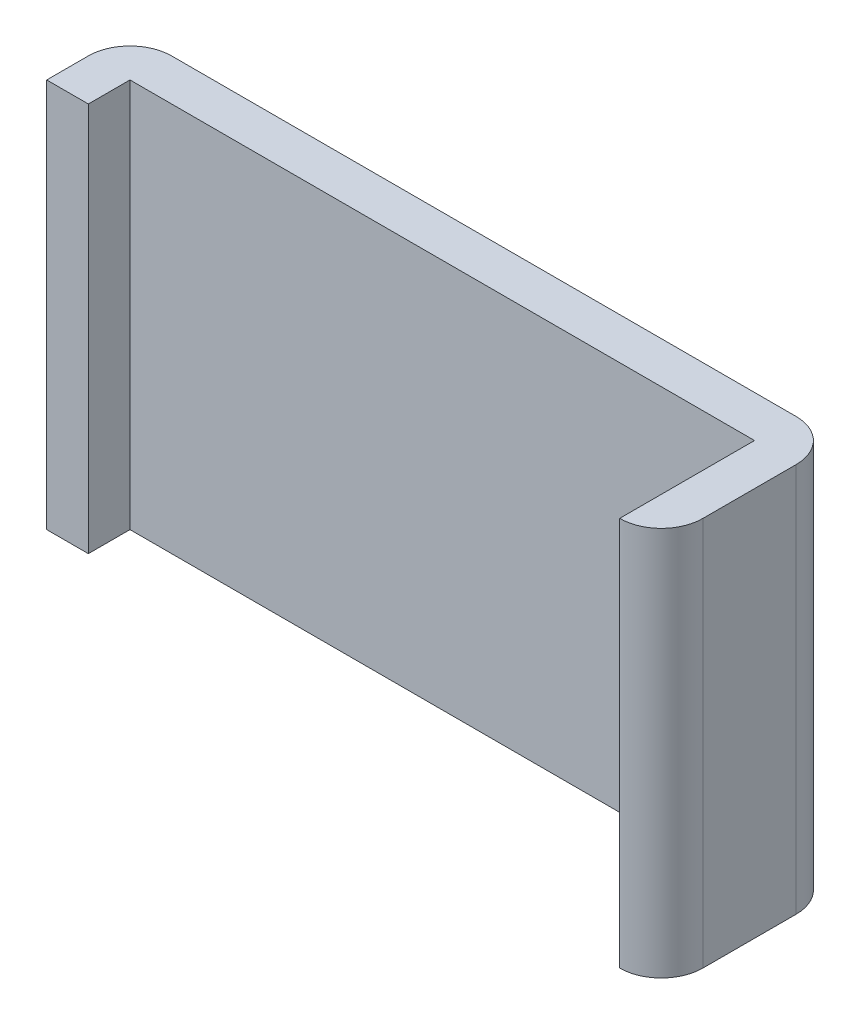
ISO-10303-21;
HEADER;
FILE_DESCRIPTION(('STEP AP214'),'2;1');
FILE_NAME('part.step','',(''),(''),'','','');
FILE_SCHEMA(('AUTOMOTIVE_DESIGN { 1 0 10303 214 1 1 1 1 }'));
ENDSEC;
DATA;
#1=APPLICATION_CONTEXT('core data for automotive mechanical design processes');
#2=APPLICATION_PROTOCOL_DEFINITION('international standard','automotive_design',2000,#1);
#3=PRODUCT_CONTEXT('',#1,'mechanical');
#4=PRODUCT('Part','Part','',(#3));
#5=PRODUCT_RELATED_PRODUCT_CATEGORY('part','',(#4));
#6=PRODUCT_DEFINITION_FORMATION('','',#4);
#7=PRODUCT_DEFINITION_CONTEXT('part definition',#1,'design');
#8=PRODUCT_DEFINITION('design','',#6,#7);
#9=PRODUCT_DEFINITION_SHAPE('','',#8);
#10=(LENGTH_UNIT() NAMED_UNIT(*) SI_UNIT(.MILLI.,.METRE.));
#11=(NAMED_UNIT(*) PLANE_ANGLE_UNIT() SI_UNIT($,.RADIAN.));
#12=(NAMED_UNIT(*) SI_UNIT($,.STERADIAN.) SOLID_ANGLE_UNIT());
#13=UNCERTAINTY_MEASURE_WITH_UNIT(LENGTH_MEASURE(1.E-05),#10,'distance_accuracy_value','');
#14=(GEOMETRIC_REPRESENTATION_CONTEXT(3) GLOBAL_UNCERTAINTY_ASSIGNED_CONTEXT((#13)) GLOBAL_UNIT_ASSIGNED_CONTEXT((#10,
#11,#12)) REPRESENTATION_CONTEXT('',''));
#15=CARTESIAN_POINT('',(0.,0.,0.));
#16=DIRECTION('',(0.,0.,1.));
#17=DIRECTION('',(1.,0.,0.));
#18=AXIS2_PLACEMENT_3D('',#15,#16,#17);
#19=CARTESIAN_POINT('',(4.575,-1.8042,0.81));
#20=DIRECTION('',(0.,-1.,0.));
#21=DIRECTION('',(0.,0.,-1.));
#22=AXIS2_PLACEMENT_3D('',#19,#20,#21);
#23=CYLINDRICAL_SURFACE('',#22,0.25);
#24=CARTESIAN_POINT('',(4.575,0.5342,0.81));
#25=DIRECTION('',(0.,-1.,0.));
#26=DIRECTION('',(0.,0.,-1.));
#27=AXIS2_PLACEMENT_3D('',#24,#25,#26);
#28=CIRCLE('',#27,0.25);
#29=CARTESIAN_POINT('',(4.825,0.5342,0.81));
#30=VERTEX_POINT('',#29);
#31=CARTESIAN_POINT('',(4.575,0.5342,1.06));
#32=VERTEX_POINT('',#31);
#33=EDGE_CURVE('E85',#30,#32,#28,.T.);
#34=ORIENTED_EDGE('',*,*,#33,.T.);
#35=DIRECTION('',(0.,-1.,0.));
#36=VECTOR('',#35,1.);
#37=CARTESIAN_POINT('',(4.575,-1.8042,1.06));
#38=LINE('',#37,#36);
#39=CARTESIAN_POINT('',(4.575,-1.8042,1.06));
#40=VERTEX_POINT('',#39);
#41=EDGE_CURVE('E71',#32,#40,#38,.T.);
#42=ORIENTED_EDGE('',*,*,#41,.T.);
#43=CARTESIAN_POINT('',(4.575,-1.8042,0.81));
#44=DIRECTION('',(0.,-1.,0.));
#45=DIRECTION('',(0.,0.,-1.));
#46=AXIS2_PLACEMENT_3D('',#43,#44,#45);
#47=CIRCLE('',#46,0.25);
#48=CARTESIAN_POINT('',(4.825,-1.8042,0.81));
#49=VERTEX_POINT('',#48);
#50=EDGE_CURVE('E20',#40,#49,#47,.F.);
#51=ORIENTED_EDGE('',*,*,#50,.T.);
#52=DIRECTION('',(0.,1.,0.));
#53=VECTOR('',#52,1.);
#54=CARTESIAN_POINT('',(4.825,-1.8042,0.81));
#55=LINE('',#54,#53);
#56=EDGE_CURVE('E77',#49,#30,#55,.T.);
#57=ORIENTED_EDGE('',*,*,#56,.T.);
#58=EDGE_LOOP('',(#34,#42,#51,#57));
#59=FACE_BOUND('',#58,.T.);
#60=ADVANCED_FACE('F17',(#59),#23,.T.);
#61=CARTESIAN_POINT('',(0.575,-1.8042,0.5));
#62=DIRECTION('',(0.,0.,-1.));
#63=DIRECTION('',(-1.,0.,0.));
#64=AXIS2_PLACEMENT_3D('',#61,#62,#63);
#65=PLANE('',#64);
#66=DIRECTION('',(0.,1.,0.));
#67=VECTOR('',#66,1.);
#68=CARTESIAN_POINT('',(0.825,-1.8042,0.5));
#69=LINE('',#68,#67);
#70=CARTESIAN_POINT('',(0.825,-1.8042,0.5));
#71=VERTEX_POINT('',#70);
#72=CARTESIAN_POINT('',(0.825,0.5342,0.5));
#73=VERTEX_POINT('',#72);
#74=EDGE_CURVE('E117',#71,#73,#69,.T.);
#75=ORIENTED_EDGE('',*,*,#74,.T.);
#76=DIRECTION('',(-1.,0.,0.));
#77=VECTOR('',#76,1.);
#78=CARTESIAN_POINT('',(0.575,0.5342,0.5));
#79=LINE('',#78,#77);
#80=CARTESIAN_POINT('',(0.575,0.5342,0.5));
#81=VERTEX_POINT('',#80);
#82=EDGE_CURVE('E86',#81,#73,#79,.F.);
#83=ORIENTED_EDGE('',*,*,#82,.F.);
#84=DIRECTION('',(0.,1.,0.));
#85=VECTOR('',#84,1.);
#86=CARTESIAN_POINT('',(0.575,-1.8042,0.5));
#87=LINE('',#86,#85);
#88=CARTESIAN_POINT('',(0.575,-1.8042,0.5));
#89=VERTEX_POINT('',#88);
#90=EDGE_CURVE('E138',#81,#89,#87,.F.);
#91=ORIENTED_EDGE('',*,*,#90,.T.);
#92=DIRECTION('',(-1.,0.,0.));
#93=VECTOR('',#92,1.);
#94=CARTESIAN_POINT('',(0.575,-1.8042,0.5));
#95=LINE('',#94,#93);
#96=EDGE_CURVE('E126',#71,#89,#95,.T.);
#97=ORIENTED_EDGE('',*,*,#96,.F.);
#98=EDGE_LOOP('',(#75,#83,#91,#97));
#99=FACE_BOUND('',#98,.T.);
#100=ADVANCED_FACE('F300',(#99),#65,.F.);
#101=CARTESIAN_POINT('',(0.825,-1.8042,0.5));
#102=DIRECTION('',(-1.,0.,0.));
#103=DIRECTION('',(0.,0.,1.));
#104=AXIS2_PLACEMENT_3D('',#101,#102,#103);
#105=PLANE('',#104);
#106=DIRECTION('',(0.,1.,0.));
#107=VECTOR('',#106,1.);
#108=CARTESIAN_POINT('',(0.825,-1.8042,0.25));
#109=LINE('',#108,#107);
#110=CARTESIAN_POINT('',(0.825,-1.8042,0.25));
#111=VERTEX_POINT('',#110);
#112=CARTESIAN_POINT('',(0.825,0.5342,0.25));
#113=VERTEX_POINT('',#112);
#114=EDGE_CURVE('E148',#111,#113,#109,.T.);
#115=ORIENTED_EDGE('',*,*,#114,.T.);
#116=DIRECTION('',(0.,0.,1.));
#117=VECTOR('',#116,1.);
#118=CARTESIAN_POINT('',(0.825,0.5342,0.5));
#119=LINE('',#118,#117);
#120=EDGE_CURVE('E114',#73,#113,#119,.F.);
#121=ORIENTED_EDGE('',*,*,#120,.F.);
#122=ORIENTED_EDGE('',*,*,#74,.F.);
#123=DIRECTION('',(0.,0.,1.));
#124=VECTOR('',#123,1.);
#125=CARTESIAN_POINT('',(0.825,-1.8042,0.5));
#126=LINE('',#125,#124);
#127=EDGE_CURVE('E109',#111,#71,#126,.T.);
#128=ORIENTED_EDGE('',*,*,#127,.F.);
#129=EDGE_LOOP('',(#115,#121,#122,#128));
#130=FACE_BOUND('',#129,.T.);
#131=ADVANCED_FACE('F222',(#130),#105,.F.);
#132=CARTESIAN_POINT('',(4.575,-1.8042,0.25));
#133=DIRECTION('',(1.,0.,0.));
#134=DIRECTION('',(0.,0.,-1.));
#135=AXIS2_PLACEMENT_3D('',#132,#133,#134);
#136=PLANE('',#135);
#137=DIRECTION('',(0.,0.,-1.));
#138=VECTOR('',#137,1.);
#139=CARTESIAN_POINT('',(4.575,-1.8042,0.25));
#140=LINE('',#139,#138);
#141=CARTESIAN_POINT('',(4.575,-1.8042,0.25));
#142=VERTEX_POINT('',#141);
#143=EDGE_CURVE('E67',#40,#142,#140,.T.);
#144=ORIENTED_EDGE('',*,*,#143,.F.);
#145=ORIENTED_EDGE('',*,*,#41,.F.);
#146=DIRECTION('',(0.,0.,-1.));
#147=VECTOR('',#146,1.);
#148=CARTESIAN_POINT('',(4.575,0.5342,0.25));
#149=LINE('',#148,#147);
#150=CARTESIAN_POINT('',(4.575,0.5342,0.25));
#151=VERTEX_POINT('',#150);
#152=EDGE_CURVE('E78',#151,#32,#149,.F.);
#153=ORIENTED_EDGE('',*,*,#152,.F.);
#154=DIRECTION('',(0.,1.,0.));
#155=VECTOR('',#154,1.);
#156=CARTESIAN_POINT('',(4.575,-1.8042,0.25));
#157=LINE('',#156,#155);
#158=EDGE_CURVE('E73',#151,#142,#157,.F.);
#159=ORIENTED_EDGE('',*,*,#158,.T.);
#160=EDGE_LOOP('',(#144,#145,#153,#159));
#161=FACE_BOUND('',#160,.T.);
#162=ADVANCED_FACE('F69',(#161),#136,.F.);
#163=CARTESIAN_POINT('',(4.825,-1.8042,0.81));
#164=DIRECTION('',(-1.,0.,0.));
#165=DIRECTION('',(0.,0.,1.));
#166=AXIS2_PLACEMENT_3D('',#163,#164,#165);
#167=PLANE('',#166);
#168=DIRECTION('',(0.,-1.,0.));
#169=VECTOR('',#168,1.);
#170=CARTESIAN_POINT('',(4.825,-1.8042,0.25));
#171=LINE('',#170,#169);
#172=CARTESIAN_POINT('',(4.825,0.5342,0.25));
#173=VERTEX_POINT('',#172);
#174=CARTESIAN_POINT('',(4.825,-1.8042,0.25));
#175=VERTEX_POINT('',#174);
#176=EDGE_CURVE('E152',#173,#175,#171,.T.);
#177=ORIENTED_EDGE('',*,*,#176,.F.);
#178=DIRECTION('',(0.,0.,1.));
#179=VECTOR('',#178,1.);
#180=CARTESIAN_POINT('',(4.825,0.5342,0.81));
#181=LINE('',#180,#179);
#182=EDGE_CURVE('E128',#30,#173,#181,.F.);
#183=ORIENTED_EDGE('',*,*,#182,.F.);
#184=ORIENTED_EDGE('',*,*,#56,.F.);
#185=DIRECTION('',(0.,0.,1.));
#186=VECTOR('',#185,1.);
#187=CARTESIAN_POINT('',(4.825,-1.8042,0.81));
#188=LINE('',#187,#186);
#189=EDGE_CURVE('E92',#175,#49,#188,.T.);
#190=ORIENTED_EDGE('',*,*,#189,.F.);
#191=EDGE_LOOP('',(#177,#183,#184,#190));
#192=FACE_BOUND('',#191,.T.);
#193=ADVANCED_FACE('F213',(#192),#167,.F.);
#194=CARTESIAN_POINT('',(0.575,-1.8042,0.25));
#195=DIRECTION('',(1.,0.,0.));
#196=DIRECTION('',(0.,0.,-1.));
#197=AXIS2_PLACEMENT_3D('',#194,#195,#196);
#198=PLANE('',#197);
#199=ORIENTED_EDGE('',*,*,#90,.F.);
#200=DIRECTION('',(0.,0.,-1.));
#201=VECTOR('',#200,1.);
#202=CARTESIAN_POINT('',(0.575,0.5342,0.25));
#203=LINE('',#202,#201);
#204=CARTESIAN_POINT('',(0.575,0.5342,0.25));
#205=VERTEX_POINT('',#204);
#206=EDGE_CURVE('E98',#81,#205,#203,.T.);
#207=ORIENTED_EDGE('',*,*,#206,.T.);
#208=DIRECTION('',(0.,-1.,0.));
#209=VECTOR('',#208,1.);
#210=CARTESIAN_POINT('',(0.575,-1.8042,0.25));
#211=LINE('',#210,#209);
#212=CARTESIAN_POINT('',(0.575,-1.8042,0.25));
#213=VERTEX_POINT('',#212);
#214=EDGE_CURVE('E97',#213,#205,#211,.F.);
#215=ORIENTED_EDGE('',*,*,#214,.F.);
#216=DIRECTION('',(0.,0.,-1.));
#217=VECTOR('',#216,1.);
#218=CARTESIAN_POINT('',(0.575,-1.8042,0.25));
#219=LINE('',#218,#217);
#220=EDGE_CURVE('E144',#89,#213,#219,.T.);
#221=ORIENTED_EDGE('',*,*,#220,.F.);
#222=EDGE_LOOP('',(#199,#207,#215,#221));
#223=FACE_BOUND('',#222,.T.);
#224=ADVANCED_FACE('F198',(#223),#198,.F.);
#225=CARTESIAN_POINT('',(0.825,-1.8042,0.25));
#226=DIRECTION('',(0.,0.,-1.));
#227=DIRECTION('',(-1.,0.,0.));
#228=AXIS2_PLACEMENT_3D('',#225,#226,#227);
#229=PLANE('',#228);
#230=ORIENTED_EDGE('',*,*,#158,.F.);
#231=DIRECTION('',(1.,0.,0.));
#232=VECTOR('',#231,1.);
#233=CARTESIAN_POINT('',(4.575,0.5342,0.25));
#234=LINE('',#233,#232);
#235=EDGE_CURVE('E156',#151,#113,#234,.F.);
#236=ORIENTED_EDGE('',*,*,#235,.T.);
#237=ORIENTED_EDGE('',*,*,#114,.F.);
#238=DIRECTION('',(1.,0.,0.));
#239=VECTOR('',#238,1.);
#240=CARTESIAN_POINT('',(4.575,-1.8042,0.25));
#241=LINE('',#240,#239);
#242=EDGE_CURVE('E101',#142,#111,#241,.F.);
#243=ORIENTED_EDGE('',*,*,#242,.F.);
#244=EDGE_LOOP('',(#230,#236,#237,#243));
#245=FACE_BOUND('',#244,.T.);
#246=ADVANCED_FACE('F175',(#245),#229,.F.);
#247=CARTESIAN_POINT('',(4.575,-1.8042,0.25));
#248=DIRECTION('',(0.,-1.,0.));
#249=DIRECTION('',(0.,0.,-1.));
#250=AXIS2_PLACEMENT_3D('',#247,#248,#249);
#251=CYLINDRICAL_SURFACE('',#250,0.25);
#252=CARTESIAN_POINT('',(4.575,0.5342,0.25));
#253=DIRECTION('',(0.,-1.,0.));
#254=DIRECTION('',(0.,0.,-1.));
#255=AXIS2_PLACEMENT_3D('',#252,#253,#254);
#256=CIRCLE('',#255,0.25);
#257=CARTESIAN_POINT('',(4.575,0.5342,0.));
#258=VERTEX_POINT('',#257);
#259=EDGE_CURVE('E94',#258,#173,#256,.T.);
#260=ORIENTED_EDGE('',*,*,#259,.T.);
#261=ORIENTED_EDGE('',*,*,#176,.T.);
#262=CARTESIAN_POINT('',(4.575,-1.8042,0.25));
#263=DIRECTION('',(0.,-1.,0.));
#264=DIRECTION('',(0.,0.,-1.));
#265=AXIS2_PLACEMENT_3D('',#262,#263,#264);
#266=CIRCLE('',#265,0.25);
#267=CARTESIAN_POINT('',(4.575,-1.8042,0.));
#268=VERTEX_POINT('',#267);
#269=EDGE_CURVE('E103',#268,#175,#266,.T.);
#270=ORIENTED_EDGE('',*,*,#269,.F.);
#271=DIRECTION('',(0.,1.,0.));
#272=VECTOR('',#271,1.);
#273=CARTESIAN_POINT('',(4.575,-1.8042,0.));
#274=LINE('',#273,#272);
#275=EDGE_CURVE('E105',#268,#258,#274,.T.);
#276=ORIENTED_EDGE('',*,*,#275,.T.);
#277=EDGE_LOOP('',(#260,#261,#270,#276));
#278=FACE_BOUND('',#277,.T.);
#279=ADVANCED_FACE('F211',(#278),#251,.T.);
#280=CARTESIAN_POINT('',(4.575,0.5342,0.25));
#281=DIRECTION('',(0.,-1.,0.));
#282=DIRECTION('',(0.,0.,-1.));
#283=AXIS2_PLACEMENT_3D('',#280,#281,#282);
#284=PLANE('',#283);
#285=ORIENTED_EDGE('',*,*,#152,.T.);
#286=ORIENTED_EDGE('',*,*,#33,.F.);
#287=ORIENTED_EDGE('',*,*,#182,.T.);
#288=ORIENTED_EDGE('',*,*,#259,.F.);
#289=DIRECTION('',(1.,0.,0.));
#290=VECTOR('',#289,1.);
#291=CARTESIAN_POINT('',(4.575,0.5342,0.));
#292=LINE('',#291,#290);
#293=CARTESIAN_POINT('',(0.825,0.5342,0.));
#294=VERTEX_POINT('',#293);
#295=EDGE_CURVE('E163',#258,#294,#292,.F.);
#296=ORIENTED_EDGE('',*,*,#295,.T.);
#297=CARTESIAN_POINT('',(0.825,0.5342,0.25));
#298=DIRECTION('',(0.,-1.,0.));
#299=DIRECTION('',(0.,0.,-1.));
#300=AXIS2_PLACEMENT_3D('',#297,#298,#299);
#301=CIRCLE('',#300,0.25);
#302=EDGE_CURVE('E99',#205,#294,#301,.T.);
#303=ORIENTED_EDGE('',*,*,#302,.F.);
#304=ORIENTED_EDGE('',*,*,#206,.F.);
#305=ORIENTED_EDGE('',*,*,#82,.T.);
#306=ORIENTED_EDGE('',*,*,#120,.T.);
#307=ORIENTED_EDGE('',*,*,#235,.F.);
#308=EDGE_LOOP('',(#285,#286,#287,#288,#296,#303,#304,#305,#306,#307));
#309=FACE_BOUND('',#308,.T.);
#310=ADVANCED_FACE('F208',(#309),#284,.F.);
#311=CARTESIAN_POINT('',(0.825,-1.8042,0.25));
#312=DIRECTION('',(0.,-1.,0.));
#313=DIRECTION('',(0.,0.,-1.));
#314=AXIS2_PLACEMENT_3D('',#311,#312,#313);
#315=CYLINDRICAL_SURFACE('',#314,0.25);
#316=ORIENTED_EDGE('',*,*,#302,.T.);
#317=DIRECTION('',(0.,1.,0.));
#318=VECTOR('',#317,1.);
#319=CARTESIAN_POINT('',(0.825,-1.8042,0.));
#320=LINE('',#319,#318);
#321=CARTESIAN_POINT('',(0.825,-1.8042,0.));
#322=VERTEX_POINT('',#321);
#323=EDGE_CURVE('E26',#294,#322,#320,.F.);
#324=ORIENTED_EDGE('',*,*,#323,.T.);
#325=CARTESIAN_POINT('',(0.825,-1.8042,0.25));
#326=DIRECTION('',(0.,-1.,0.));
#327=DIRECTION('',(0.,0.,-1.));
#328=AXIS2_PLACEMENT_3D('',#325,#326,#327);
#329=CIRCLE('',#328,0.25);
#330=EDGE_CURVE('E34',#213,#322,#329,.T.);
#331=ORIENTED_EDGE('',*,*,#330,.F.);
#332=ORIENTED_EDGE('',*,*,#214,.T.);
#333=EDGE_LOOP('',(#316,#324,#331,#332));
#334=FACE_BOUND('',#333,.T.);
#335=ADVANCED_FACE('F202',(#334),#315,.T.);
#336=CARTESIAN_POINT('',(4.575,-1.8042,0.25));
#337=DIRECTION('',(0.,-1.,0.));
#338=DIRECTION('',(0.,0.,-1.));
#339=AXIS2_PLACEMENT_3D('',#336,#337,#338);
#340=PLANE('',#339);
#341=ORIENTED_EDGE('',*,*,#50,.F.);
#342=ORIENTED_EDGE('',*,*,#143,.T.);
#343=ORIENTED_EDGE('',*,*,#242,.T.);
#344=ORIENTED_EDGE('',*,*,#127,.T.);
#345=ORIENTED_EDGE('',*,*,#96,.T.);
#346=ORIENTED_EDGE('',*,*,#220,.T.);
#347=ORIENTED_EDGE('',*,*,#330,.T.);
#348=DIRECTION('',(1.,0.,0.));
#349=VECTOR('',#348,1.);
#350=CARTESIAN_POINT('',(4.575,-1.8042,0.));
#351=LINE('',#350,#349);
#352=EDGE_CURVE('E11',#322,#268,#351,.T.);
#353=ORIENTED_EDGE('',*,*,#352,.T.);
#354=ORIENTED_EDGE('',*,*,#269,.T.);
#355=ORIENTED_EDGE('',*,*,#189,.T.);
#356=EDGE_LOOP('',(#341,#342,#343,#344,#345,#346,#347,#353,#354,#355));
#357=FACE_BOUND('',#356,.T.);
#358=ADVANCED_FACE('F89',(#357),#340,.T.);
#359=CARTESIAN_POINT('',(4.575,-1.8042,0.));
#360=DIRECTION('',(0.,0.,1.));
#361=DIRECTION('',(1.,0.,0.));
#362=AXIS2_PLACEMENT_3D('',#359,#360,#361);
#363=PLANE('',#362);
#364=ORIENTED_EDGE('',*,*,#323,.F.);
#365=ORIENTED_EDGE('',*,*,#295,.F.);
#366=ORIENTED_EDGE('',*,*,#275,.F.);
#367=ORIENTED_EDGE('',*,*,#352,.F.);
#368=EDGE_LOOP('',(#364,#365,#366,#367));
#369=FACE_BOUND('',#368,.T.);
#370=ADVANCED_FACE('F206',(#369),#363,.F.);
#371=CLOSED_SHELL('',(#60,#100,#131,#162,#193,#224,#246,#279,#310,#335,#358,#370));
#372=MANIFOLD_SOLID_BREP('B1',#371);
#373=ADVANCED_BREP_SHAPE_REPRESENTATION('',(#18,#372),#14);
#374=SHAPE_DEFINITION_REPRESENTATION(#9,#373);
ENDSEC;
END-ISO-10303-21;
